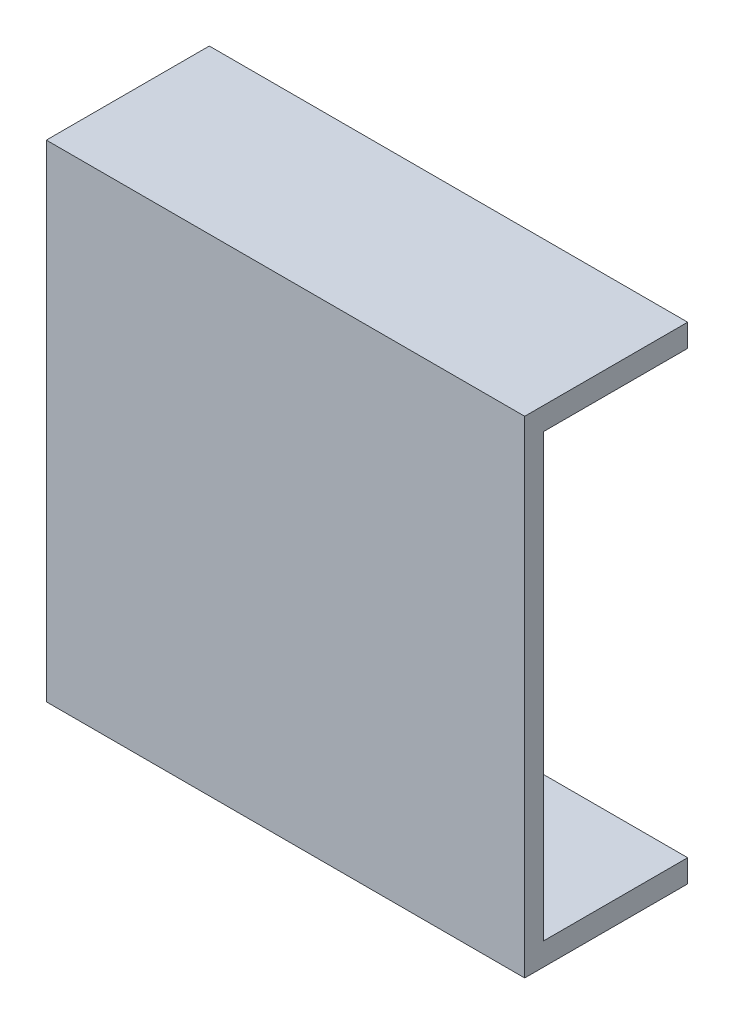
ISO-10303-21;
HEADER;
FILE_DESCRIPTION(('STEP AP214'),'2;1');
FILE_NAME('part.step','',(''),(''),'','','');
FILE_SCHEMA(('AUTOMOTIVE_DESIGN { 1 0 10303 214 1 1 1 1 }'));
ENDSEC;
DATA;
#1=APPLICATION_CONTEXT('core data for automotive mechanical design processes');
#2=APPLICATION_PROTOCOL_DEFINITION('international standard','automotive_design',2000,#1);
#3=PRODUCT_CONTEXT('',#1,'mechanical');
#4=PRODUCT('Part','Part','',(#3));
#5=PRODUCT_RELATED_PRODUCT_CATEGORY('part','',(#4));
#6=PRODUCT_DEFINITION_FORMATION('','',#4);
#7=PRODUCT_DEFINITION_CONTEXT('part definition',#1,'design');
#8=PRODUCT_DEFINITION('design','',#6,#7);
#9=PRODUCT_DEFINITION_SHAPE('','',#8);
#10=(LENGTH_UNIT() NAMED_UNIT(*) SI_UNIT(.MILLI.,.METRE.));
#11=(NAMED_UNIT(*) PLANE_ANGLE_UNIT() SI_UNIT($,.RADIAN.));
#12=(NAMED_UNIT(*) SI_UNIT($,.STERADIAN.) SOLID_ANGLE_UNIT());
#13=UNCERTAINTY_MEASURE_WITH_UNIT(LENGTH_MEASURE(1.E-05),#10,'distance_accuracy_value','');
#14=(GEOMETRIC_REPRESENTATION_CONTEXT(3) GLOBAL_UNCERTAINTY_ASSIGNED_CONTEXT((#13)) GLOBAL_UNIT_ASSIGNED_CONTEXT((#10,
#11,#12)) REPRESENTATION_CONTEXT('',''));
#15=CARTESIAN_POINT('',(0.,0.,0.));
#16=DIRECTION('',(0.,0.,1.));
#17=DIRECTION('',(1.,0.,0.));
#18=AXIS2_PLACEMENT_3D('',#15,#16,#17);
#19=CARTESIAN_POINT('',(-147.5,0.,0.));
#20=DIRECTION('',(0.,0.,1.));
#21=DIRECTION('',(1.,0.,0.));
#22=AXIS2_PLACEMENT_3D('',#19,#20,#21);
#23=PLANE('',#22);
#24=DIRECTION('',(1.,0.,0.));
#25=VECTOR('',#24,1.);
#26=CARTESIAN_POINT('',(147.5,14.,0.));
#27=LINE('',#26,#25);
#28=CARTESIAN_POINT('',(-147.5,14.,0.));
#29=VERTEX_POINT('',#28);
#30=CARTESIAN_POINT('',(147.5,14.,0.));
#31=VERTEX_POINT('',#30);
#32=EDGE_CURVE('E121',#29,#31,#27,.T.);
#33=ORIENTED_EDGE('',*,*,#32,.F.);
#34=DIRECTION('',(0.,-1.,0.));
#35=VECTOR('',#34,1.);
#36=CARTESIAN_POINT('',(-147.5,300.,0.));
#37=LINE('',#36,#35);
#38=CARTESIAN_POINT('',(-147.5,286.,0.));
#39=VERTEX_POINT('',#38);
#40=EDGE_CURVE('E151',#39,#29,#37,.T.);
#41=ORIENTED_EDGE('',*,*,#40,.F.);
#42=DIRECTION('',(-1.,0.,0.));
#43=VECTOR('',#42,1.);
#44=CARTESIAN_POINT('',(147.5,286.,0.));
#45=LINE('',#44,#43);
#46=CARTESIAN_POINT('',(147.5,286.,0.));
#47=VERTEX_POINT('',#46);
#48=EDGE_CURVE('E130',#47,#39,#45,.T.);
#49=ORIENTED_EDGE('',*,*,#48,.F.);
#50=DIRECTION('',(0.,1.,0.));
#51=VECTOR('',#50,1.);
#52=CARTESIAN_POINT('',(147.5,300.,0.));
#53=LINE('',#52,#51);
#54=EDGE_CURVE('E38',#31,#47,#53,.T.);
#55=ORIENTED_EDGE('',*,*,#54,.F.);
#56=EDGE_LOOP('',(#33,#41,#49,#55));
#57=FACE_BOUND('',#56,.T.);
#58=ADVANCED_FACE('F34',(#57),#23,.F.);
#59=CARTESIAN_POINT('',(-147.5,0.,11.5));
#60=DIRECTION('',(0.,0.,1.));
#61=DIRECTION('',(1.,0.,0.));
#62=AXIS2_PLACEMENT_3D('',#59,#60,#61);
#63=PLANE('',#62);
#64=DIRECTION('',(0.,1.,0.));
#65=VECTOR('',#64,1.);
#66=CARTESIAN_POINT('',(147.5,300.,11.5));
#67=LINE('',#66,#65);
#68=CARTESIAN_POINT('',(147.5,0.,11.5));
#69=VERTEX_POINT('',#68);
#70=CARTESIAN_POINT('',(147.5,300.,11.5));
#71=VERTEX_POINT('',#70);
#72=EDGE_CURVE('E105',#69,#71,#67,.T.);
#73=ORIENTED_EDGE('',*,*,#72,.T.);
#74=DIRECTION('',(-1.,0.,0.));
#75=VECTOR('',#74,1.);
#76=CARTESIAN_POINT('',(-147.5,300.,11.5));
#77=LINE('',#76,#75);
#78=CARTESIAN_POINT('',(-147.5,300.,11.5));
#79=VERTEX_POINT('',#78);
#80=EDGE_CURVE('E167',#71,#79,#77,.T.);
#81=ORIENTED_EDGE('',*,*,#80,.T.);
#82=DIRECTION('',(0.,-1.,0.));
#83=VECTOR('',#82,1.);
#84=CARTESIAN_POINT('',(-147.5,300.,11.5));
#85=LINE('',#84,#83);
#86=CARTESIAN_POINT('',(-147.5,0.,11.5));
#87=VERTEX_POINT('',#86);
#88=EDGE_CURVE('E145',#79,#87,#85,.T.);
#89=ORIENTED_EDGE('',*,*,#88,.T.);
#90=DIRECTION('',(1.,0.,0.));
#91=VECTOR('',#90,1.);
#92=CARTESIAN_POINT('',(-147.5,0.,11.5));
#93=LINE('',#92,#91);
#94=EDGE_CURVE('E164',#87,#69,#93,.T.);
#95=ORIENTED_EDGE('',*,*,#94,.T.);
#96=EDGE_LOOP('',(#73,#81,#89,#95));
#97=FACE_BOUND('',#96,.T.);
#98=ADVANCED_FACE('F200',(#97),#63,.T.);
#99=CARTESIAN_POINT('',(-147.5,300.,11.5));
#100=DIRECTION('',(1.,0.,0.));
#101=DIRECTION('',(0.,0.,-1.));
#102=AXIS2_PLACEMENT_3D('',#99,#100,#101);
#103=PLANE('',#102);
#104=DIRECTION('',(0.,1.,0.));
#105=VECTOR('',#104,1.);
#106=CARTESIAN_POINT('',(-147.5,0.,-89.));
#107=LINE('',#106,#105);
#108=CARTESIAN_POINT('',(-147.5,0.,-89.));
#109=VERTEX_POINT('',#108);
#110=CARTESIAN_POINT('',(-147.5,14.,-89.));
#111=VERTEX_POINT('',#110);
#112=EDGE_CURVE('E116',#109,#111,#107,.T.);
#113=ORIENTED_EDGE('',*,*,#112,.F.);
#114=DIRECTION('',(0.,0.,-1.));
#115=VECTOR('',#114,1.);
#116=CARTESIAN_POINT('',(-147.5,0.,11.5));
#117=LINE('',#116,#115);
#118=EDGE_CURVE('E11',#87,#109,#117,.T.);
#119=ORIENTED_EDGE('',*,*,#118,.F.);
#120=ORIENTED_EDGE('',*,*,#88,.F.);
#121=DIRECTION('',(0.,0.,-1.));
#122=VECTOR('',#121,1.);
#123=CARTESIAN_POINT('',(-147.5,300.,11.5));
#124=LINE('',#123,#122);
#125=CARTESIAN_POINT('',(-147.5,300.,-89.));
#126=VERTEX_POINT('',#125);
#127=EDGE_CURVE('E170',#79,#126,#124,.T.);
#128=ORIENTED_EDGE('',*,*,#127,.T.);
#129=DIRECTION('',(0.,1.,0.));
#130=VECTOR('',#129,1.);
#131=CARTESIAN_POINT('',(-147.5,300.,-89.));
#132=LINE('',#131,#130);
#133=CARTESIAN_POINT('',(-147.5,286.,-89.));
#134=VERTEX_POINT('',#133);
#135=EDGE_CURVE('E136',#134,#126,#132,.T.);
#136=ORIENTED_EDGE('',*,*,#135,.F.);
#137=DIRECTION('',(0.,0.,1.));
#138=VECTOR('',#137,1.);
#139=CARTESIAN_POINT('',(-147.5,286.,-89.));
#140=LINE('',#139,#138);
#141=EDGE_CURVE('E142',#134,#39,#140,.T.);
#142=ORIENTED_EDGE('',*,*,#141,.T.);
#143=ORIENTED_EDGE('',*,*,#40,.T.);
#144=DIRECTION('',(0.,0.,1.));
#145=VECTOR('',#144,1.);
#146=CARTESIAN_POINT('',(-147.5,14.,-89.));
#147=LINE('',#146,#145);
#148=EDGE_CURVE('E128',#111,#29,#147,.T.);
#149=ORIENTED_EDGE('',*,*,#148,.F.);
#150=EDGE_LOOP('',(#113,#119,#120,#128,#136,#142,#143,#149));
#151=FACE_BOUND('',#150,.T.);
#152=ADVANCED_FACE('F36',(#151),#103,.F.);
#153=CARTESIAN_POINT('',(-147.5,0.,11.5));
#154=DIRECTION('',(0.,1.,0.));
#155=DIRECTION('',(0.,0.,1.));
#156=AXIS2_PLACEMENT_3D('',#153,#154,#155);
#157=PLANE('',#156);
#158=DIRECTION('',(-1.,0.,0.));
#159=VECTOR('',#158,1.);
#160=CARTESIAN_POINT('',(147.5,0.,-89.));
#161=LINE('',#160,#159);
#162=CARTESIAN_POINT('',(147.5,0.,-89.));
#163=VERTEX_POINT('',#162);
#164=EDGE_CURVE('E111',#163,#109,#161,.T.);
#165=ORIENTED_EDGE('',*,*,#164,.F.);
#166=DIRECTION('',(0.,0.,-1.));
#167=VECTOR('',#166,1.);
#168=CARTESIAN_POINT('',(147.5,0.,11.5));
#169=LINE('',#168,#167);
#170=EDGE_CURVE('E44',#69,#163,#169,.T.);
#171=ORIENTED_EDGE('',*,*,#170,.F.);
#172=ORIENTED_EDGE('',*,*,#94,.F.);
#173=ORIENTED_EDGE('',*,*,#118,.T.);
#174=EDGE_LOOP('',(#165,#171,#172,#173));
#175=FACE_BOUND('',#174,.T.);
#176=ADVANCED_FACE('F112',(#175),#157,.F.);
#177=CARTESIAN_POINT('',(147.5,300.,11.5));
#178=DIRECTION('',(-1.,0.,0.));
#179=DIRECTION('',(0.,0.,1.));
#180=AXIS2_PLACEMENT_3D('',#177,#178,#179);
#181=PLANE('',#180);
#182=DIRECTION('',(0.,0.,1.));
#183=VECTOR('',#182,1.);
#184=CARTESIAN_POINT('',(147.5,14.,-89.));
#185=LINE('',#184,#183);
#186=CARTESIAN_POINT('',(147.5,14.,-89.));
#187=VERTEX_POINT('',#186);
#188=EDGE_CURVE('E52',#187,#31,#185,.T.);
#189=ORIENTED_EDGE('',*,*,#188,.T.);
#190=ORIENTED_EDGE('',*,*,#54,.T.);
#191=DIRECTION('',(0.,0.,1.));
#192=VECTOR('',#191,1.);
#193=CARTESIAN_POINT('',(147.5,286.,-89.));
#194=LINE('',#193,#192);
#195=CARTESIAN_POINT('',(147.5,286.,-89.));
#196=VERTEX_POINT('',#195);
#197=EDGE_CURVE('E155',#196,#47,#194,.T.);
#198=ORIENTED_EDGE('',*,*,#197,.F.);
#199=DIRECTION('',(0.,-1.,0.));
#200=VECTOR('',#199,1.);
#201=CARTESIAN_POINT('',(147.5,300.,-89.));
#202=LINE('',#201,#200);
#203=CARTESIAN_POINT('',(147.5,300.,-89.));
#204=VERTEX_POINT('',#203);
#205=EDGE_CURVE('E131',#204,#196,#202,.T.);
#206=ORIENTED_EDGE('',*,*,#205,.F.);
#207=DIRECTION('',(0.,0.,-1.));
#208=VECTOR('',#207,1.);
#209=CARTESIAN_POINT('',(147.5,300.,11.5));
#210=LINE('',#209,#208);
#211=EDGE_CURVE('E108',#71,#204,#210,.T.);
#212=ORIENTED_EDGE('',*,*,#211,.F.);
#213=ORIENTED_EDGE('',*,*,#72,.F.);
#214=ORIENTED_EDGE('',*,*,#170,.T.);
#215=DIRECTION('',(0.,-1.,0.));
#216=VECTOR('',#215,1.);
#217=CARTESIAN_POINT('',(147.5,0.,-89.));
#218=LINE('',#217,#216);
#219=EDGE_CURVE('E103',#187,#163,#218,.T.);
#220=ORIENTED_EDGE('',*,*,#219,.F.);
#221=EDGE_LOOP('',(#189,#190,#198,#206,#212,#213,#214,#220));
#222=FACE_BOUND('',#221,.T.);
#223=ADVANCED_FACE('F101',(#222),#181,.F.);
#224=CARTESIAN_POINT('',(-147.5,300.,11.5));
#225=DIRECTION('',(0.,-1.,0.));
#226=DIRECTION('',(0.,0.,-1.));
#227=AXIS2_PLACEMENT_3D('',#224,#225,#226);
#228=PLANE('',#227);
#229=DIRECTION('',(1.,0.,0.));
#230=VECTOR('',#229,1.);
#231=CARTESIAN_POINT('',(147.5,300.,-89.));
#232=LINE('',#231,#230);
#233=EDGE_CURVE('E139',#126,#204,#232,.T.);
#234=ORIENTED_EDGE('',*,*,#233,.F.);
#235=ORIENTED_EDGE('',*,*,#127,.F.);
#236=ORIENTED_EDGE('',*,*,#80,.F.);
#237=ORIENTED_EDGE('',*,*,#211,.T.);
#238=EDGE_LOOP('',(#234,#235,#236,#237));
#239=FACE_BOUND('',#238,.T.);
#240=ADVANCED_FACE('F178',(#239),#228,.F.);
#241=CARTESIAN_POINT('',(147.5,286.,-89.));
#242=DIRECTION('',(0.,1.,0.));
#243=DIRECTION('',(0.,0.,1.));
#244=AXIS2_PLACEMENT_3D('',#241,#242,#243);
#245=PLANE('',#244);
#246=ORIENTED_EDGE('',*,*,#48,.T.);
#247=ORIENTED_EDGE('',*,*,#141,.F.);
#248=DIRECTION('',(-1.,0.,0.));
#249=VECTOR('',#248,1.);
#250=CARTESIAN_POINT('',(147.5,286.,-89.));
#251=LINE('',#250,#249);
#252=EDGE_CURVE('E134',#196,#134,#251,.T.);
#253=ORIENTED_EDGE('',*,*,#252,.F.);
#254=ORIENTED_EDGE('',*,*,#197,.T.);
#255=EDGE_LOOP('',(#246,#247,#253,#254));
#256=FACE_BOUND('',#255,.T.);
#257=ADVANCED_FACE('F189',(#256),#245,.F.);
#258=CARTESIAN_POINT('',(147.5,286.,-89.));
#259=DIRECTION('',(0.,0.,-1.));
#260=DIRECTION('',(-1.,0.,0.));
#261=AXIS2_PLACEMENT_3D('',#258,#259,#260);
#262=PLANE('',#261);
#263=ORIENTED_EDGE('',*,*,#205,.T.);
#264=ORIENTED_EDGE('',*,*,#252,.T.);
#265=ORIENTED_EDGE('',*,*,#135,.T.);
#266=ORIENTED_EDGE('',*,*,#233,.T.);
#267=EDGE_LOOP('',(#263,#264,#265,#266));
#268=FACE_BOUND('',#267,.T.);
#269=ADVANCED_FACE('F182',(#268),#262,.T.);
#270=CARTESIAN_POINT('',(147.5,14.,-89.));
#271=DIRECTION('',(0.,-1.,0.));
#272=DIRECTION('',(1.,0.,0.));
#273=AXIS2_PLACEMENT_3D('',#270,#271,#272);
#274=PLANE('',#273);
#275=ORIENTED_EDGE('',*,*,#32,.T.);
#276=ORIENTED_EDGE('',*,*,#188,.F.);
#277=DIRECTION('',(1.,0.,0.));
#278=VECTOR('',#277,1.);
#279=CARTESIAN_POINT('',(147.5,14.,-89.));
#280=LINE('',#279,#278);
#281=EDGE_CURVE('E120',#111,#187,#280,.T.);
#282=ORIENTED_EDGE('',*,*,#281,.F.);
#283=ORIENTED_EDGE('',*,*,#148,.T.);
#284=EDGE_LOOP('',(#275,#276,#282,#283));
#285=FACE_BOUND('',#284,.T.);
#286=ADVANCED_FACE('F187',(#285),#274,.F.);
#287=CARTESIAN_POINT('',(147.5,0.,-89.));
#288=DIRECTION('',(0.,0.,1.));
#289=DIRECTION('',(1.,0.,0.));
#290=AXIS2_PLACEMENT_3D('',#287,#288,#289);
#291=PLANE('',#290);
#292=ORIENTED_EDGE('',*,*,#219,.T.);
#293=ORIENTED_EDGE('',*,*,#164,.T.);
#294=ORIENTED_EDGE('',*,*,#112,.T.);
#295=ORIENTED_EDGE('',*,*,#281,.T.);
#296=EDGE_LOOP('',(#292,#293,#294,#295));
#297=FACE_BOUND('',#296,.T.);
#298=ADVANCED_FACE('F118',(#297),#291,.F.);
#299=CLOSED_SHELL('',(#58,#98,#152,#176,#223,#240,#257,#269,#286,#298));
#300=MANIFOLD_SOLID_BREP('B2',#299);
#301=ADVANCED_BREP_SHAPE_REPRESENTATION('',(#18,#300),#14);
#302=SHAPE_DEFINITION_REPRESENTATION(#9,#301);
ENDSEC;
END-ISO-10303-21;
